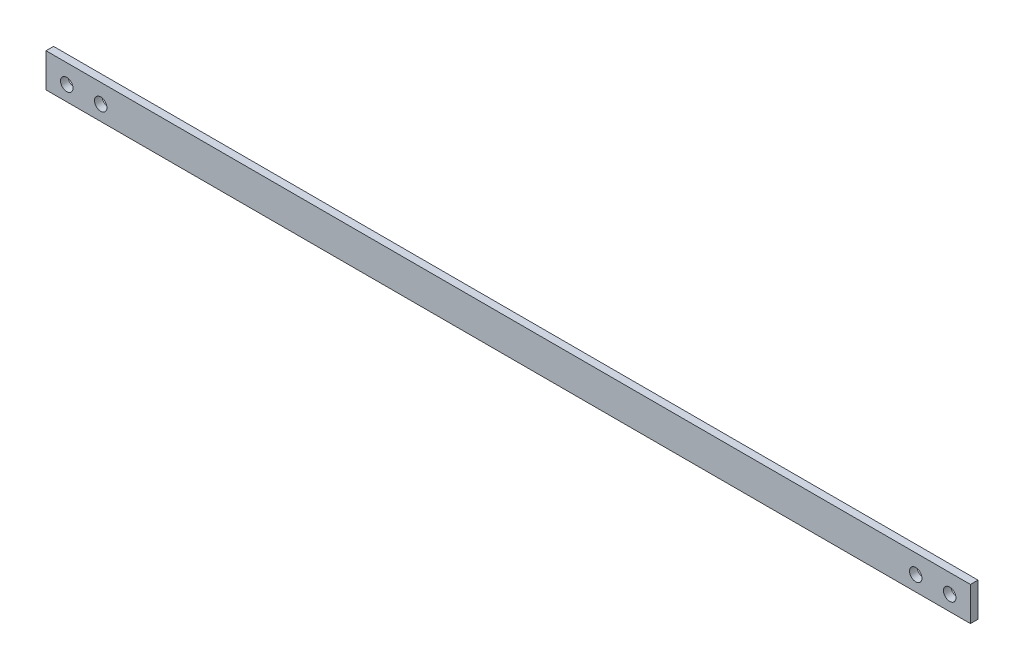
ISO-10303-21;
HEADER;
FILE_DESCRIPTION(('STEP AP214'),'2;1');
FILE_NAME('part.step','',(''),(''),'','','');
FILE_SCHEMA(('AUTOMOTIVE_DESIGN { 1 0 10303 214 1 1 1 1 }'));
ENDSEC;
DATA;
#1=APPLICATION_CONTEXT('core data for automotive mechanical design processes');
#2=APPLICATION_PROTOCOL_DEFINITION('international standard','automotive_design',2000,#1);
#3=PRODUCT_CONTEXT('',#1,'mechanical');
#4=PRODUCT('Part','Part','',(#3));
#5=PRODUCT_RELATED_PRODUCT_CATEGORY('part','',(#4));
#6=PRODUCT_DEFINITION_FORMATION('','',#4);
#7=PRODUCT_DEFINITION_CONTEXT('part definition',#1,'design');
#8=PRODUCT_DEFINITION('design','',#6,#7);
#9=PRODUCT_DEFINITION_SHAPE('','',#8);
#10=(LENGTH_UNIT() NAMED_UNIT(*) SI_UNIT(.MILLI.,.METRE.));
#11=(NAMED_UNIT(*) PLANE_ANGLE_UNIT() SI_UNIT($,.RADIAN.));
#12=(NAMED_UNIT(*) SI_UNIT($,.STERADIAN.) SOLID_ANGLE_UNIT());
#13=UNCERTAINTY_MEASURE_WITH_UNIT(LENGTH_MEASURE(1.E-05),#10,'distance_accuracy_value','');
#14=(GEOMETRIC_REPRESENTATION_CONTEXT(3) GLOBAL_UNCERTAINTY_ASSIGNED_CONTEXT((#13)) GLOBAL_UNIT_ASSIGNED_CONTEXT((#10,
#11,#12)) REPRESENTATION_CONTEXT('',''));
#15=CARTESIAN_POINT('',(0.,0.,0.));
#16=DIRECTION('',(0.,0.,1.));
#17=DIRECTION('',(1.,0.,0.));
#18=AXIS2_PLACEMENT_3D('',#15,#16,#17);
#19=CARTESIAN_POINT('',(0.,0.,2.));
#20=DIRECTION('',(0.,0.,-1.));
#21=DIRECTION('',(-1.,0.,0.));
#22=AXIS2_PLACEMENT_3D('',#19,#20,#21);
#23=PLANE('',#22);
#24=DIRECTION('',(0.,-1.,0.));
#25=VECTOR('',#24,1.);
#26=CARTESIAN_POINT('',(0.,0.,2.));
#27=LINE('',#26,#25);
#28=CARTESIAN_POINT('',(0.,9.,2.));
#29=VERTEX_POINT('',#28);
#30=CARTESIAN_POINT('',(0.,0.,2.));
#31=VERTEX_POINT('',#30);
#32=EDGE_CURVE('E86',#29,#31,#27,.T.);
#33=ORIENTED_EDGE('',*,*,#32,.T.);
#34=DIRECTION('',(1.,0.,0.));
#35=VECTOR('',#34,1.);
#36=CARTESIAN_POINT('',(0.,0.,2.));
#37=LINE('',#36,#35);
#38=CARTESIAN_POINT('',(245.,0.,2.));
#39=VERTEX_POINT('',#38);
#40=EDGE_CURVE('E81',#31,#39,#37,.T.);
#41=ORIENTED_EDGE('',*,*,#40,.T.);
#42=DIRECTION('',(0.,1.,0.));
#43=VECTOR('',#42,1.);
#44=CARTESIAN_POINT('',(245.,0.,2.));
#45=LINE('',#44,#43);
#46=CARTESIAN_POINT('',(245.,9.,2.));
#47=VERTEX_POINT('',#46);
#48=EDGE_CURVE('E84',#39,#47,#45,.T.);
#49=ORIENTED_EDGE('',*,*,#48,.T.);
#50=DIRECTION('',(-1.,0.,0.));
#51=VECTOR('',#50,1.);
#52=CARTESIAN_POINT('',(0.,9.,2.));
#53=LINE('',#52,#51);
#54=EDGE_CURVE('E51',#47,#29,#53,.T.);
#55=ORIENTED_EDGE('',*,*,#54,.T.);
#56=EDGE_LOOP('',(#33,#41,#49,#55));
#57=FACE_BOUND('',#56,.T.);
#58=CARTESIAN_POINT('',(5.5,4.,2.));
#59=DIRECTION('',(0.,0.,1.));
#60=DIRECTION('',(1.,0.,0.));
#61=AXIS2_PLACEMENT_3D('',#58,#59,#60);
#62=CIRCLE('',#61,1.65);
#63=CARTESIAN_POINT('',(7.15,4.,2.));
#64=VERTEX_POINT('',#63);
#65=EDGE_CURVE('E101',#64,#64,#62,.T.);
#66=ORIENTED_EDGE('',*,*,#65,.F.);
#67=EDGE_LOOP('',(#66));
#68=FACE_BOUND('',#67,.T.);
#69=CARTESIAN_POINT('',(14.5,4.,2.));
#70=DIRECTION('',(0.,0.,1.));
#71=DIRECTION('',(1.,0.,0.));
#72=AXIS2_PLACEMENT_3D('',#69,#70,#71);
#73=CIRCLE('',#72,1.65);
#74=CARTESIAN_POINT('',(16.15,4.,2.));
#75=VERTEX_POINT('',#74);
#76=EDGE_CURVE('E116',#75,#75,#73,.T.);
#77=ORIENTED_EDGE('',*,*,#76,.F.);
#78=EDGE_LOOP('',(#77));
#79=FACE_BOUND('',#78,.T.);
#80=CARTESIAN_POINT('',(230.5,4.,2.));
#81=DIRECTION('',(0.,0.,1.));
#82=DIRECTION('',(-1.,0.,0.));
#83=AXIS2_PLACEMENT_3D('',#80,#81,#82);
#84=CIRCLE('',#83,1.64999999999999);
#85=CARTESIAN_POINT('',(228.85,4.,2.));
#86=VERTEX_POINT('',#85);
#87=EDGE_CURVE('E122',#86,#86,#84,.T.);
#88=ORIENTED_EDGE('',*,*,#87,.F.);
#89=EDGE_LOOP('',(#88));
#90=FACE_BOUND('',#89,.T.);
#91=CARTESIAN_POINT('',(239.5,4.,2.));
#92=DIRECTION('',(0.,0.,1.));
#93=DIRECTION('',(-1.,0.,0.));
#94=AXIS2_PLACEMENT_3D('',#91,#92,#93);
#95=CIRCLE('',#94,1.65000000000002);
#96=CARTESIAN_POINT('',(237.85,4.,2.));
#97=VERTEX_POINT('',#96);
#98=EDGE_CURVE('E128',#97,#97,#95,.T.);
#99=ORIENTED_EDGE('',*,*,#98,.F.);
#100=EDGE_LOOP('',(#99));
#101=FACE_BOUND('',#100,.T.);
#102=ADVANCED_FACE('F34',(#57,#68,#79,#90,#101),#23,.F.);
#103=CARTESIAN_POINT('',(0.,0.,0.));
#104=DIRECTION('',(0.,0.,-1.));
#105=DIRECTION('',(-1.,0.,0.));
#106=AXIS2_PLACEMENT_3D('',#103,#104,#105);
#107=PLANE('',#106);
#108=CARTESIAN_POINT('',(230.5,4.,0.));
#109=DIRECTION('',(0.,0.,1.));
#110=DIRECTION('',(-1.,0.,0.));
#111=AXIS2_PLACEMENT_3D('',#108,#109,#110);
#112=CIRCLE('',#111,1.64999999999999);
#113=CARTESIAN_POINT('',(228.85,4.,0.));
#114=VERTEX_POINT('',#113);
#115=EDGE_CURVE('E125',#114,#114,#112,.T.);
#116=ORIENTED_EDGE('',*,*,#115,.T.);
#117=EDGE_LOOP('',(#116));
#118=FACE_BOUND('',#117,.T.);
#119=CARTESIAN_POINT('',(5.5,4.,0.));
#120=DIRECTION('',(0.,0.,1.));
#121=DIRECTION('',(1.,0.,0.));
#122=AXIS2_PLACEMENT_3D('',#119,#120,#121);
#123=CIRCLE('',#122,1.65);
#124=CARTESIAN_POINT('',(7.15,4.,0.));
#125=VERTEX_POINT('',#124);
#126=EDGE_CURVE('E113',#125,#125,#123,.T.);
#127=ORIENTED_EDGE('',*,*,#126,.T.);
#128=EDGE_LOOP('',(#127));
#129=FACE_BOUND('',#128,.T.);
#130=DIRECTION('',(0.,-1.,0.));
#131=VECTOR('',#130,1.);
#132=CARTESIAN_POINT('',(0.,0.,0.));
#133=LINE('',#132,#131);
#134=CARTESIAN_POINT('',(0.,9.,0.));
#135=VERTEX_POINT('',#134);
#136=CARTESIAN_POINT('',(0.,0.,0.));
#137=VERTEX_POINT('',#136);
#138=EDGE_CURVE('E98',#135,#137,#133,.T.);
#139=ORIENTED_EDGE('',*,*,#138,.F.);
#140=DIRECTION('',(-1.,0.,0.));
#141=VECTOR('',#140,1.);
#142=CARTESIAN_POINT('',(0.,9.,0.));
#143=LINE('',#142,#141);
#144=CARTESIAN_POINT('',(245.,9.,0.));
#145=VERTEX_POINT('',#144);
#146=EDGE_CURVE('E74',#145,#135,#143,.T.);
#147=ORIENTED_EDGE('',*,*,#146,.F.);
#148=DIRECTION('',(0.,1.,0.));
#149=VECTOR('',#148,1.);
#150=CARTESIAN_POINT('',(245.,0.,0.));
#151=LINE('',#150,#149);
#152=CARTESIAN_POINT('',(245.,0.,0.));
#153=VERTEX_POINT('',#152);
#154=EDGE_CURVE('E68',#153,#145,#151,.T.);
#155=ORIENTED_EDGE('',*,*,#154,.F.);
#156=DIRECTION('',(1.,0.,0.));
#157=VECTOR('',#156,1.);
#158=CARTESIAN_POINT('',(0.,0.,0.));
#159=LINE('',#158,#157);
#160=EDGE_CURVE('E90',#137,#153,#159,.T.);
#161=ORIENTED_EDGE('',*,*,#160,.F.);
#162=EDGE_LOOP('',(#139,#147,#155,#161));
#163=FACE_BOUND('',#162,.T.);
#164=CARTESIAN_POINT('',(14.5,4.,0.));
#165=DIRECTION('',(0.,0.,1.));
#166=DIRECTION('',(1.,0.,0.));
#167=AXIS2_PLACEMENT_3D('',#164,#165,#166);
#168=CIRCLE('',#167,1.65);
#169=CARTESIAN_POINT('',(16.15,4.,0.));
#170=VERTEX_POINT('',#169);
#171=EDGE_CURVE('E119',#170,#170,#168,.T.);
#172=ORIENTED_EDGE('',*,*,#171,.T.);
#173=EDGE_LOOP('',(#172));
#174=FACE_BOUND('',#173,.T.);
#175=CARTESIAN_POINT('',(239.5,4.,0.));
#176=DIRECTION('',(0.,0.,1.));
#177=DIRECTION('',(-1.,0.,0.));
#178=AXIS2_PLACEMENT_3D('',#175,#176,#177);
#179=CIRCLE('',#178,1.65000000000002);
#180=CARTESIAN_POINT('',(237.85,4.,0.));
#181=VERTEX_POINT('',#180);
#182=EDGE_CURVE('E131',#181,#181,#179,.T.);
#183=ORIENTED_EDGE('',*,*,#182,.T.);
#184=EDGE_LOOP('',(#183));
#185=FACE_BOUND('',#184,.T.);
#186=ADVANCED_FACE('F109',(#118,#129,#163,#174,#185),#107,.T.);
#187=CARTESIAN_POINT('',(0.,0.,2.));
#188=DIRECTION('',(1.,0.,0.));
#189=DIRECTION('',(0.,0.,-1.));
#190=AXIS2_PLACEMENT_3D('',#187,#188,#189);
#191=PLANE('',#190);
#192=ORIENTED_EDGE('',*,*,#138,.T.);
#193=DIRECTION('',(0.,0.,-1.));
#194=VECTOR('',#193,1.);
#195=CARTESIAN_POINT('',(0.,0.,2.));
#196=LINE('',#195,#194);
#197=EDGE_CURVE('E11',#31,#137,#196,.T.);
#198=ORIENTED_EDGE('',*,*,#197,.F.);
#199=ORIENTED_EDGE('',*,*,#32,.F.);
#200=DIRECTION('',(0.,0.,-1.));
#201=VECTOR('',#200,1.);
#202=CARTESIAN_POINT('',(0.,9.,2.));
#203=LINE('',#202,#201);
#204=EDGE_CURVE('E94',#29,#135,#203,.T.);
#205=ORIENTED_EDGE('',*,*,#204,.T.);
#206=EDGE_LOOP('',(#192,#198,#199,#205));
#207=FACE_BOUND('',#206,.T.);
#208=ADVANCED_FACE('F36',(#207),#191,.F.);
#209=CARTESIAN_POINT('',(0.,0.,2.));
#210=DIRECTION('',(0.,1.,0.));
#211=DIRECTION('',(0.,0.,1.));
#212=AXIS2_PLACEMENT_3D('',#209,#210,#211);
#213=PLANE('',#212);
#214=ORIENTED_EDGE('',*,*,#160,.T.);
#215=DIRECTION('',(0.,0.,-1.));
#216=VECTOR('',#215,1.);
#217=CARTESIAN_POINT('',(245.,0.,2.));
#218=LINE('',#217,#216);
#219=EDGE_CURVE('E43',#39,#153,#218,.T.);
#220=ORIENTED_EDGE('',*,*,#219,.F.);
#221=ORIENTED_EDGE('',*,*,#40,.F.);
#222=ORIENTED_EDGE('',*,*,#197,.T.);
#223=EDGE_LOOP('',(#214,#220,#221,#222));
#224=FACE_BOUND('',#223,.T.);
#225=ADVANCED_FACE('F89',(#224),#213,.F.);
#226=CARTESIAN_POINT('',(245.,0.,2.));
#227=DIRECTION('',(-1.,0.,0.));
#228=DIRECTION('',(0.,0.,1.));
#229=AXIS2_PLACEMENT_3D('',#226,#227,#228);
#230=PLANE('',#229);
#231=ORIENTED_EDGE('',*,*,#154,.T.);
#232=DIRECTION('',(0.,0.,-1.));
#233=VECTOR('',#232,1.);
#234=CARTESIAN_POINT('',(245.,9.,2.));
#235=LINE('',#234,#233);
#236=EDGE_CURVE('E91',#47,#145,#235,.T.);
#237=ORIENTED_EDGE('',*,*,#236,.F.);
#238=ORIENTED_EDGE('',*,*,#48,.F.);
#239=ORIENTED_EDGE('',*,*,#219,.T.);
#240=EDGE_LOOP('',(#231,#237,#238,#239));
#241=FACE_BOUND('',#240,.T.);
#242=ADVANCED_FACE('F92',(#241),#230,.F.);
#243=CARTESIAN_POINT('',(0.,9.,2.));
#244=DIRECTION('',(0.,-1.,0.));
#245=DIRECTION('',(0.,0.,-1.));
#246=AXIS2_PLACEMENT_3D('',#243,#244,#245);
#247=PLANE('',#246);
#248=ORIENTED_EDGE('',*,*,#146,.T.);
#249=ORIENTED_EDGE('',*,*,#204,.F.);
#250=ORIENTED_EDGE('',*,*,#54,.F.);
#251=ORIENTED_EDGE('',*,*,#236,.T.);
#252=EDGE_LOOP('',(#248,#249,#250,#251));
#253=FACE_BOUND('',#252,.T.);
#254=ADVANCED_FACE('F106',(#253),#247,.F.);
#255=CARTESIAN_POINT('',(5.5,4.,2.));
#256=DIRECTION('',(0.,0.,-1.));
#257=DIRECTION('',(-1.,0.,0.));
#258=AXIS2_PLACEMENT_3D('',#255,#256,#257);
#259=CYLINDRICAL_SURFACE('',#258,1.65);
#260=ORIENTED_EDGE('',*,*,#65,.T.);
#261=EDGE_LOOP('',(#260));
#262=FACE_BOUND('',#261,.T.);
#263=ORIENTED_EDGE('',*,*,#126,.F.);
#264=EDGE_LOOP('',(#263));
#265=FACE_BOUND('',#264,.T.);
#266=ADVANCED_FACE('F148',(#262,#265),#259,.F.);
#267=CARTESIAN_POINT('',(14.5,4.,2.));
#268=DIRECTION('',(0.,0.,-1.));
#269=DIRECTION('',(-1.,0.,0.));
#270=AXIS2_PLACEMENT_3D('',#267,#268,#269);
#271=CYLINDRICAL_SURFACE('',#270,1.65);
#272=ORIENTED_EDGE('',*,*,#76,.T.);
#273=EDGE_LOOP('',(#272));
#274=FACE_BOUND('',#273,.T.);
#275=ORIENTED_EDGE('',*,*,#171,.F.);
#276=EDGE_LOOP('',(#275));
#277=FACE_BOUND('',#276,.T.);
#278=ADVANCED_FACE('F194',(#274,#277),#271,.F.);
#279=CARTESIAN_POINT('',(230.5,4.,2.));
#280=DIRECTION('',(0.,0.,-1.));
#281=DIRECTION('',(-1.,0.,0.));
#282=AXIS2_PLACEMENT_3D('',#279,#280,#281);
#283=CYLINDRICAL_SURFACE('',#282,1.64999999999999);
#284=ORIENTED_EDGE('',*,*,#87,.T.);
#285=EDGE_LOOP('',(#284));
#286=FACE_BOUND('',#285,.T.);
#287=ORIENTED_EDGE('',*,*,#115,.F.);
#288=EDGE_LOOP('',(#287));
#289=FACE_BOUND('',#288,.T.);
#290=ADVANCED_FACE('F202',(#286,#289),#283,.F.);
#291=CARTESIAN_POINT('',(239.5,4.,2.));
#292=DIRECTION('',(0.,0.,-1.));
#293=DIRECTION('',(-1.,0.,0.));
#294=AXIS2_PLACEMENT_3D('',#291,#292,#293);
#295=CYLINDRICAL_SURFACE('',#294,1.65000000000002);
#296=ORIENTED_EDGE('',*,*,#98,.T.);
#297=EDGE_LOOP('',(#296));
#298=FACE_BOUND('',#297,.T.);
#299=ORIENTED_EDGE('',*,*,#182,.F.);
#300=EDGE_LOOP('',(#299));
#301=FACE_BOUND('',#300,.T.);
#302=ADVANCED_FACE('F137',(#298,#301),#295,.F.);
#303=CLOSED_SHELL('',(#102,#186,#208,#225,#242,#254,#266,#278,#290,#302));
#304=MANIFOLD_SOLID_BREP('B2',#303);
#305=ADVANCED_BREP_SHAPE_REPRESENTATION('',(#18,#304),#14);
#306=SHAPE_DEFINITION_REPRESENTATION(#9,#305);
ENDSEC;
END-ISO-10303-21;
